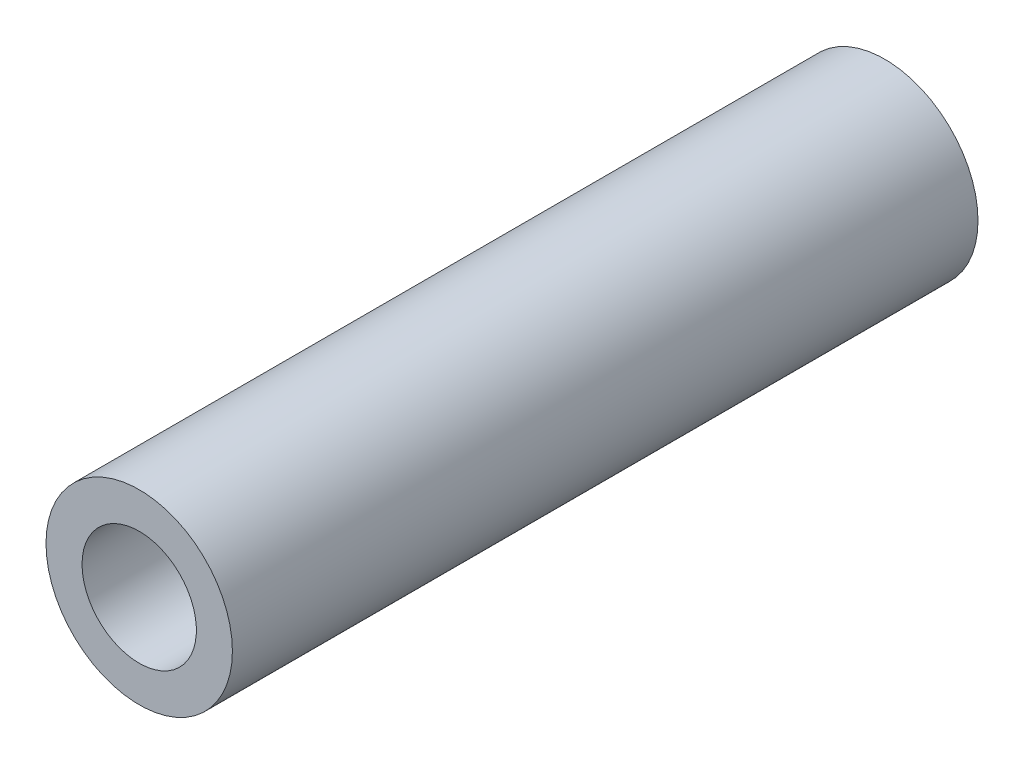
ISO-10303-21;
HEADER;
FILE_DESCRIPTION(('STEP AP214'),'2;1');
FILE_NAME('part.step','',(''),(''),'','','');
FILE_SCHEMA(('AUTOMOTIVE_DESIGN { 1 0 10303 214 1 1 1 1 }'));
ENDSEC;
DATA;
#1=APPLICATION_CONTEXT('core data for automotive mechanical design processes');
#2=APPLICATION_PROTOCOL_DEFINITION('international standard','automotive_design',2000,#1);
#3=PRODUCT_CONTEXT('',#1,'mechanical');
#4=PRODUCT('Part','Part','',(#3));
#5=PRODUCT_RELATED_PRODUCT_CATEGORY('part','',(#4));
#6=PRODUCT_DEFINITION_FORMATION('','',#4);
#7=PRODUCT_DEFINITION_CONTEXT('part definition',#1,'design');
#8=PRODUCT_DEFINITION('design','',#6,#7);
#9=PRODUCT_DEFINITION_SHAPE('','',#8);
#10=(LENGTH_UNIT() NAMED_UNIT(*) SI_UNIT(.MILLI.,.METRE.));
#11=(NAMED_UNIT(*) PLANE_ANGLE_UNIT() SI_UNIT($,.RADIAN.));
#12=(NAMED_UNIT(*) SI_UNIT($,.STERADIAN.) SOLID_ANGLE_UNIT());
#13=UNCERTAINTY_MEASURE_WITH_UNIT(LENGTH_MEASURE(1.E-05),#10,'distance_accuracy_value','');
#14=(GEOMETRIC_REPRESENTATION_CONTEXT(3) GLOBAL_UNCERTAINTY_ASSIGNED_CONTEXT((#13)) GLOBAL_UNIT_ASSIGNED_CONTEXT((#10,
#11,#12)) REPRESENTATION_CONTEXT('',''));
#15=CARTESIAN_POINT('',(0.,0.,0.));
#16=DIRECTION('',(0.,0.,1.));
#17=DIRECTION('',(1.,0.,0.));
#18=AXIS2_PLACEMENT_3D('',#15,#16,#17);
#19=CARTESIAN_POINT('',(0.,0.,9.525));
#20=DIRECTION('',(0.,0.,1.));
#21=DIRECTION('',(1.,0.,0.));
#22=AXIS2_PLACEMENT_3D('',#19,#20,#21);
#23=PLANE('',#22);
#24=CARTESIAN_POINT('',(0.,0.,9.525));
#25=DIRECTION('',(0.,0.,1.));
#26=DIRECTION('',(1.,0.,0.));
#27=AXIS2_PLACEMENT_3D('',#24,#25,#26);
#28=CIRCLE('',#27,2.38125);
#29=CARTESIAN_POINT('',(-2.38125,0.,9.525));
#30=VERTEX_POINT('',#29);
#31=EDGE_CURVE('E10',#30,#30,#28,.T.);
#32=ORIENTED_EDGE('',*,*,#31,.T.);
#33=EDGE_LOOP('',(#32));
#34=FACE_BOUND('',#33,.T.);
#35=CARTESIAN_POINT('',(0.,0.,9.525));
#36=DIRECTION('',(0.,0.,1.));
#37=DIRECTION('',(1.,0.,0.));
#38=AXIS2_PLACEMENT_3D('',#35,#36,#37);
#39=CIRCLE('',#38,1.4605);
#40=CARTESIAN_POINT('',(-1.4605,0.,9.525));
#41=VERTEX_POINT('',#40);
#42=EDGE_CURVE('E41',#41,#41,#39,.T.);
#43=ORIENTED_EDGE('',*,*,#42,.F.);
#44=EDGE_LOOP('',(#43));
#45=FACE_BOUND('',#44,.T.);
#46=ADVANCED_FACE('F30',(#34,#45),#23,.T.);
#47=CARTESIAN_POINT('',(0.,0.,-9.525));
#48=DIRECTION('',(0.,0.,1.));
#49=DIRECTION('',(1.,0.,0.));
#50=AXIS2_PLACEMENT_3D('',#47,#48,#49);
#51=PLANE('',#50);
#52=CARTESIAN_POINT('',(0.,0.,-9.525));
#53=DIRECTION('',(0.,0.,1.));
#54=DIRECTION('',(1.,0.,0.));
#55=AXIS2_PLACEMENT_3D('',#52,#53,#54);
#56=CIRCLE('',#55,2.38125);
#57=CARTESIAN_POINT('',(-2.38125,0.,-9.525));
#58=VERTEX_POINT('',#57);
#59=EDGE_CURVE('E34',#58,#58,#56,.T.);
#60=ORIENTED_EDGE('',*,*,#59,.F.);
#61=EDGE_LOOP('',(#60));
#62=FACE_BOUND('',#61,.T.);
#63=CARTESIAN_POINT('',(0.,0.,-9.525));
#64=DIRECTION('',(0.,0.,1.));
#65=DIRECTION('',(1.,0.,0.));
#66=AXIS2_PLACEMENT_3D('',#63,#64,#65);
#67=CIRCLE('',#66,1.4605);
#68=CARTESIAN_POINT('',(-1.4605,0.,-9.525));
#69=VERTEX_POINT('',#68);
#70=EDGE_CURVE('E43',#69,#69,#67,.T.);
#71=ORIENTED_EDGE('',*,*,#70,.T.);
#72=EDGE_LOOP('',(#71));
#73=FACE_BOUND('',#72,.T.);
#74=ADVANCED_FACE('F53',(#62,#73),#51,.F.);
#75=CARTESIAN_POINT('',(0.,0.,9.525));
#76=DIRECTION('',(0.,0.,-1.));
#77=DIRECTION('',(-1.,0.,0.));
#78=AXIS2_PLACEMENT_3D('',#75,#76,#77);
#79=CYLINDRICAL_SURFACE('',#78,2.38125);
#80=CARTESIAN_POINT('',(-2.38125,0.,9.525));
#81=CARTESIAN_POINT('',(-2.38125,0.,9.3265625));
#82=CARTESIAN_POINT('',(-2.38125,0.,9.128125));
#83=CARTESIAN_POINT('',(-2.38125,0.,8.73125));
#84=CARTESIAN_POINT('',(-2.38125,0.,8.5328125));
#85=CARTESIAN_POINT('',(-2.38125,0.,8.1359375));
#86=CARTESIAN_POINT('',(-2.38125,0.,7.9375));
#87=CARTESIAN_POINT('',(-2.38125,0.,7.540625));
#88=CARTESIAN_POINT('',(-2.38125,0.,7.3421875));
#89=CARTESIAN_POINT('',(-2.38125,0.,6.9453125));
#90=CARTESIAN_POINT('',(-2.38125,0.,6.746875));
#91=CARTESIAN_POINT('',(-2.38125,0.,6.35));
#92=CARTESIAN_POINT('',(-2.38125,0.,6.1515625));
#93=CARTESIAN_POINT('',(-2.38125,0.,5.7546875));
#94=CARTESIAN_POINT('',(-2.38125,0.,5.55625));
#95=CARTESIAN_POINT('',(-2.38125,0.,5.159375));
#96=CARTESIAN_POINT('',(-2.38125,0.,4.9609375));
#97=CARTESIAN_POINT('',(-2.38125,0.,4.5640625));
#98=CARTESIAN_POINT('',(-2.38125,0.,4.365625));
#99=CARTESIAN_POINT('',(-2.38125,0.,3.96875));
#100=CARTESIAN_POINT('',(-2.38125,0.,3.7703125));
#101=CARTESIAN_POINT('',(-2.38125,0.,3.3734375));
#102=CARTESIAN_POINT('',(-2.38125,0.,3.175));
#103=CARTESIAN_POINT('',(-2.38125,0.,2.778125));
#104=CARTESIAN_POINT('',(-2.38125,0.,2.5796875));
#105=CARTESIAN_POINT('',(-2.38125,0.,2.1828125));
#106=CARTESIAN_POINT('',(-2.38125,0.,1.984375));
#107=CARTESIAN_POINT('',(-2.38125,0.,1.5875));
#108=CARTESIAN_POINT('',(-2.38125,0.,1.3890625));
#109=CARTESIAN_POINT('',(-2.38125,0.,0.992187500000001));
#110=CARTESIAN_POINT('',(-2.38125,0.,0.793750000000001));
#111=CARTESIAN_POINT('',(-2.38125,0.,0.396875));
#112=CARTESIAN_POINT('',(-2.38125,0.,0.1984375));
#113=CARTESIAN_POINT('',(-2.38125,0.,-0.1984375));
#114=CARTESIAN_POINT('',(-2.38125,0.,-0.396875));
#115=CARTESIAN_POINT('',(-2.38125,0.,-0.793750000000001));
#116=CARTESIAN_POINT('',(-2.38125,0.,-0.992187500000001));
#117=CARTESIAN_POINT('',(-2.38125,0.,-1.3890625));
#118=CARTESIAN_POINT('',(-2.38125,0.,-1.5875));
#119=CARTESIAN_POINT('',(-2.38125,0.,-1.984375));
#120=CARTESIAN_POINT('',(-2.38125,0.,-2.1828125));
#121=CARTESIAN_POINT('',(-2.38125,0.,-2.5796875));
#122=CARTESIAN_POINT('',(-2.38125,0.,-2.778125));
#123=CARTESIAN_POINT('',(-2.38125,0.,-3.175));
#124=CARTESIAN_POINT('',(-2.38125,0.,-3.3734375));
#125=CARTESIAN_POINT('',(-2.38125,0.,-3.7703125));
#126=CARTESIAN_POINT('',(-2.38125,0.,-3.96875));
#127=CARTESIAN_POINT('',(-2.38125,0.,-4.365625));
#128=CARTESIAN_POINT('',(-2.38125,0.,-4.5640625));
#129=CARTESIAN_POINT('',(-2.38125,0.,-4.9609375));
#130=CARTESIAN_POINT('',(-2.38125,0.,-5.159375));
#131=CARTESIAN_POINT('',(-2.38125,0.,-5.55625));
#132=CARTESIAN_POINT('',(-2.38125,0.,-5.7546875));
#133=CARTESIAN_POINT('',(-2.38125,0.,-6.1515625));
#134=CARTESIAN_POINT('',(-2.38125,0.,-6.35));
#135=CARTESIAN_POINT('',(-2.38125,0.,-6.746875));
#136=CARTESIAN_POINT('',(-2.38125,0.,-6.9453125));
#137=CARTESIAN_POINT('',(-2.38125,0.,-7.3421875));
#138=CARTESIAN_POINT('',(-2.38125,0.,-7.540625));
#139=CARTESIAN_POINT('',(-2.38125,0.,-7.9375));
#140=CARTESIAN_POINT('',(-2.38125,0.,-8.1359375));
#141=CARTESIAN_POINT('',(-2.38125,0.,-8.5328125));
#142=CARTESIAN_POINT('',(-2.38125,0.,-8.73125));
#143=CARTESIAN_POINT('',(-2.38125,0.,-9.128125));
#144=CARTESIAN_POINT('',(-2.38125,0.,-9.3265625));
#145=CARTESIAN_POINT('',(-2.38125,0.,-9.525));
#146=B_SPLINE_CURVE_WITH_KNOTS('',3,(#80,#81,#82,#83,#84,#85,#86,#87,#88,#89,#90,#91,#92,#93,
#94,#95,#96,#97,#98,#99,#100,#101,#102,#103,#104,#105,#106,#107,#108,#109,#110,#111,#112,#113,
#114,#115,#116,#117,#118,#119,#120,#121,#122,#123,#124,#125,#126,#127,#128,#129,#130,#131,#132,
#133,#134,#135,#136,#137,#138,#139,#140,#141,#142,#143,#144,#145),.UNSPECIFIED.,.F.,.F.,(4,2,2,
2,2,2,2,2,2,2,2,2,2,2,2,2,2,2,2,2,2,2,2,2,2,2,2,2,2,2,2,2,4),(0.,0.5953125,1.190625,1.7859375,
2.38125,2.9765625,3.571875,4.1671875,4.7625,5.3578125,5.953125,6.5484375,7.14375,7.7390625,
8.334375,8.9296875,9.525,10.1203125,10.715625,11.3109375,11.90625,12.5015625,13.096875,
13.6921875,14.2875,14.8828125,15.478125,16.0734375,16.66875,17.2640625,17.859375,18.4546875,
19.05),.UNSPECIFIED.);
#147=EDGE_CURVE('BSEAM32',#30,#58,#146,.T.);
#148=ORIENTED_EDGE('',*,*,#31,.F.);
#149=ORIENTED_EDGE('',*,*,#59,.T.);
#150=ORIENTED_EDGE('',*,*,#147,.T.);
#151=ORIENTED_EDGE('',*,*,#147,.F.);
#152=EDGE_LOOP('',(#148,#150,#149,#151));
#153=FACE_BOUND('',#152,.T.);
#154=ADVANCED_FACE('F32',(#153),#79,.T.);
#155=CARTESIAN_POINT('',(0.,0.,9.525));
#156=DIRECTION('',(0.,0.,-1.));
#157=DIRECTION('',(-1.,0.,0.));
#158=AXIS2_PLACEMENT_3D('',#155,#156,#157);
#159=CYLINDRICAL_SURFACE('',#158,1.4605);
#160=CARTESIAN_POINT('',(-1.4605,0.,9.525));
#161=CARTESIAN_POINT('',(-1.4605,0.,9.3265625));
#162=CARTESIAN_POINT('',(-1.4605,0.,9.128125));
#163=CARTESIAN_POINT('',(-1.4605,0.,8.73125));
#164=CARTESIAN_POINT('',(-1.4605,0.,8.5328125));
#165=CARTESIAN_POINT('',(-1.4605,0.,8.1359375));
#166=CARTESIAN_POINT('',(-1.4605,0.,7.9375));
#167=CARTESIAN_POINT('',(-1.4605,0.,7.540625));
#168=CARTESIAN_POINT('',(-1.4605,0.,7.3421875));
#169=CARTESIAN_POINT('',(-1.4605,0.,6.9453125));
#170=CARTESIAN_POINT('',(-1.4605,0.,6.746875));
#171=CARTESIAN_POINT('',(-1.4605,0.,6.35));
#172=CARTESIAN_POINT('',(-1.4605,0.,6.1515625));
#173=CARTESIAN_POINT('',(-1.4605,0.,5.7546875));
#174=CARTESIAN_POINT('',(-1.4605,0.,5.55625));
#175=CARTESIAN_POINT('',(-1.4605,0.,5.159375));
#176=CARTESIAN_POINT('',(-1.4605,0.,4.9609375));
#177=CARTESIAN_POINT('',(-1.4605,0.,4.5640625));
#178=CARTESIAN_POINT('',(-1.4605,0.,4.365625));
#179=CARTESIAN_POINT('',(-1.4605,0.,3.96875));
#180=CARTESIAN_POINT('',(-1.4605,0.,3.7703125));
#181=CARTESIAN_POINT('',(-1.4605,0.,3.3734375));
#182=CARTESIAN_POINT('',(-1.4605,0.,3.175));
#183=CARTESIAN_POINT('',(-1.4605,0.,2.778125));
#184=CARTESIAN_POINT('',(-1.4605,0.,2.5796875));
#185=CARTESIAN_POINT('',(-1.4605,0.,2.1828125));
#186=CARTESIAN_POINT('',(-1.4605,0.,1.984375));
#187=CARTESIAN_POINT('',(-1.4605,0.,1.5875));
#188=CARTESIAN_POINT('',(-1.4605,0.,1.3890625));
#189=CARTESIAN_POINT('',(-1.4605,0.,0.992187500000001));
#190=CARTESIAN_POINT('',(-1.4605,0.,0.793750000000001));
#191=CARTESIAN_POINT('',(-1.4605,0.,0.396875));
#192=CARTESIAN_POINT('',(-1.4605,0.,0.1984375));
#193=CARTESIAN_POINT('',(-1.4605,0.,-0.1984375));
#194=CARTESIAN_POINT('',(-1.4605,0.,-0.396875));
#195=CARTESIAN_POINT('',(-1.4605,0.,-0.793750000000001));
#196=CARTESIAN_POINT('',(-1.4605,0.,-0.992187500000001));
#197=CARTESIAN_POINT('',(-1.4605,0.,-1.3890625));
#198=CARTESIAN_POINT('',(-1.4605,0.,-1.5875));
#199=CARTESIAN_POINT('',(-1.4605,0.,-1.984375));
#200=CARTESIAN_POINT('',(-1.4605,0.,-2.1828125));
#201=CARTESIAN_POINT('',(-1.4605,0.,-2.5796875));
#202=CARTESIAN_POINT('',(-1.4605,0.,-2.778125));
#203=CARTESIAN_POINT('',(-1.4605,0.,-3.175));
#204=CARTESIAN_POINT('',(-1.4605,0.,-3.3734375));
#205=CARTESIAN_POINT('',(-1.4605,0.,-3.7703125));
#206=CARTESIAN_POINT('',(-1.4605,0.,-3.96875));
#207=CARTESIAN_POINT('',(-1.4605,0.,-4.365625));
#208=CARTESIAN_POINT('',(-1.4605,0.,-4.5640625));
#209=CARTESIAN_POINT('',(-1.4605,0.,-4.9609375));
#210=CARTESIAN_POINT('',(-1.4605,0.,-5.159375));
#211=CARTESIAN_POINT('',(-1.4605,0.,-5.55625));
#212=CARTESIAN_POINT('',(-1.4605,0.,-5.7546875));
#213=CARTESIAN_POINT('',(-1.4605,0.,-6.1515625));
#214=CARTESIAN_POINT('',(-1.4605,0.,-6.35));
#215=CARTESIAN_POINT('',(-1.4605,0.,-6.746875));
#216=CARTESIAN_POINT('',(-1.4605,0.,-6.9453125));
#217=CARTESIAN_POINT('',(-1.4605,0.,-7.3421875));
#218=CARTESIAN_POINT('',(-1.4605,0.,-7.540625));
#219=CARTESIAN_POINT('',(-1.4605,0.,-7.9375));
#220=CARTESIAN_POINT('',(-1.4605,0.,-8.1359375));
#221=CARTESIAN_POINT('',(-1.4605,0.,-8.5328125));
#222=CARTESIAN_POINT('',(-1.4605,0.,-8.73125));
#223=CARTESIAN_POINT('',(-1.4605,0.,-9.128125));
#224=CARTESIAN_POINT('',(-1.4605,0.,-9.3265625));
#225=CARTESIAN_POINT('',(-1.4605,0.,-9.525));
#226=B_SPLINE_CURVE_WITH_KNOTS('',3,(#160,#161,#162,#163,#164,#165,#166,#167,#168,#169,#170,
#171,#172,#173,#174,#175,#176,#177,#178,#179,#180,#181,#182,#183,#184,#185,#186,#187,#188,#189,
#190,#191,#192,#193,#194,#195,#196,#197,#198,#199,#200,#201,#202,#203,#204,#205,#206,#207,#208,
#209,#210,#211,#212,#213,#214,#215,#216,#217,#218,#219,#220,#221,#222,#223,#224,#225),
.UNSPECIFIED.,.F.,.F.,(4,2,2,2,2,2,2,2,2,2,2,2,2,2,2,2,2,2,2,2,2,2,2,2,2,2,2,2,2,2,2,2,4),(0.,
0.5953125,1.190625,1.7859375,2.38125,2.9765625,3.571875,4.1671875,4.7625,5.3578125,5.953125,
6.5484375,7.14375,7.7390625,8.334375,8.9296875,9.525,10.1203125,10.715625,11.3109375,11.90625,
12.5015625,13.096875,13.6921875,14.2875,14.8828125,15.478125,16.0734375,16.66875,17.2640625,
17.859375,18.4546875,19.05),.UNSPECIFIED.);
#227=EDGE_CURVE('BSEAM49',#41,#69,#226,.T.);
#228=ORIENTED_EDGE('',*,*,#42,.T.);
#229=ORIENTED_EDGE('',*,*,#70,.F.);
#230=ORIENTED_EDGE('',*,*,#227,.T.);
#231=ORIENTED_EDGE('',*,*,#227,.F.);
#232=EDGE_LOOP('',(#228,#230,#229,#231));
#233=FACE_BOUND('',#232,.T.);
#234=ADVANCED_FACE('F49',(#233),#159,.F.);
#235=CLOSED_SHELL('',(#46,#74,#154,#234));
#236=MANIFOLD_SOLID_BREP('B2',#235);
#237=ADVANCED_BREP_SHAPE_REPRESENTATION('',(#18,#236),#14);
#238=SHAPE_DEFINITION_REPRESENTATION(#9,#237);
ENDSEC;
END-ISO-10303-21;
